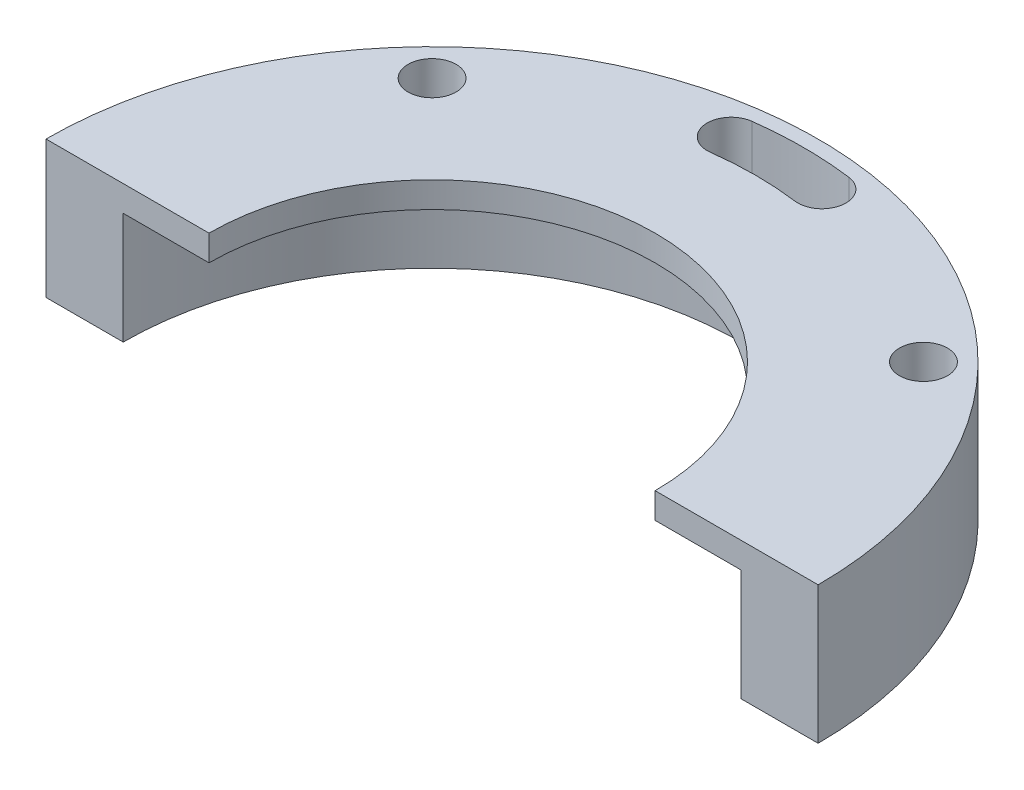
ISO-10303-21;
HEADER;
FILE_DESCRIPTION(('STEP AP214'),'2;1');
FILE_NAME('part.step','',(''),(''),'','','');
FILE_SCHEMA(('AUTOMOTIVE_DESIGN { 1 0 10303 214 1 1 1 1 }'));
ENDSEC;
DATA;
#1=APPLICATION_CONTEXT('core data for automotive mechanical design processes');
#2=APPLICATION_PROTOCOL_DEFINITION('international standard','automotive_design',2000,#1);
#3=PRODUCT_CONTEXT('',#1,'mechanical');
#4=PRODUCT('Part','Part','',(#3));
#5=PRODUCT_RELATED_PRODUCT_CATEGORY('part','',(#4));
#6=PRODUCT_DEFINITION_FORMATION('','',#4);
#7=PRODUCT_DEFINITION_CONTEXT('part definition',#1,'design');
#8=PRODUCT_DEFINITION('design','',#6,#7);
#9=PRODUCT_DEFINITION_SHAPE('','',#8);
#10=(LENGTH_UNIT() NAMED_UNIT(*) SI_UNIT(.MILLI.,.METRE.));
#11=(NAMED_UNIT(*) PLANE_ANGLE_UNIT() SI_UNIT($,.RADIAN.));
#12=(NAMED_UNIT(*) SI_UNIT($,.STERADIAN.) SOLID_ANGLE_UNIT());
#13=UNCERTAINTY_MEASURE_WITH_UNIT(LENGTH_MEASURE(1.E-05),#10,'distance_accuracy_value','');
#14=(GEOMETRIC_REPRESENTATION_CONTEXT(3) GLOBAL_UNCERTAINTY_ASSIGNED_CONTEXT((#13)) GLOBAL_UNIT_ASSIGNED_CONTEXT((#10,
#11,#12)) REPRESENTATION_CONTEXT('',''));
#15=CARTESIAN_POINT('',(0.,0.,0.));
#16=DIRECTION('',(0.,0.,1.));
#17=DIRECTION('',(1.,0.,0.));
#18=AXIS2_PLACEMENT_3D('',#15,#16,#17);
#19=CARTESIAN_POINT('',(0.,10.16,0.));
#20=DIRECTION('',(0.,-1.,0.));
#21=DIRECTION('',(0.,0.,-1.));
#22=AXIS2_PLACEMENT_3D('',#19,#20,#21);
#23=CYLINDRICAL_SURFACE('',#22,16.51);
#24=CARTESIAN_POINT('',(0.,8.255,0.));
#25=DIRECTION('',(0.,-1.,0.));
#26=DIRECTION('',(0.,0.,-1.));
#27=AXIS2_PLACEMENT_3D('',#24,#25,#26);
#28=CIRCLE('',#27,16.51);
#29=CARTESIAN_POINT('',(16.51,8.255,0.));
#30=VERTEX_POINT('',#29);
#31=CARTESIAN_POINT('',(-16.51,8.255,0.));
#32=VERTEX_POINT('',#31);
#33=EDGE_CURVE('E185',#30,#32,#28,.F.);
#34=ORIENTED_EDGE('',*,*,#33,.F.);
#35=DIRECTION('',(0.,-1.,0.));
#36=VECTOR('',#35,1.);
#37=CARTESIAN_POINT('',(16.51,10.16,0.));
#38=LINE('',#37,#36);
#39=CARTESIAN_POINT('',(16.51,10.16,0.));
#40=VERTEX_POINT('',#39);
#41=EDGE_CURVE('E172',#30,#40,#38,.F.);
#42=ORIENTED_EDGE('',*,*,#41,.T.);
#43=CARTESIAN_POINT('',(0.,10.16,0.));
#44=DIRECTION('',(0.,-1.,0.));
#45=DIRECTION('',(0.,0.,-1.));
#46=AXIS2_PLACEMENT_3D('',#43,#44,#45);
#47=CIRCLE('',#46,16.51);
#48=CARTESIAN_POINT('',(-16.51,10.16,0.));
#49=VERTEX_POINT('',#48);
#50=EDGE_CURVE('E188',#49,#40,#47,.T.);
#51=ORIENTED_EDGE('',*,*,#50,.F.);
#52=DIRECTION('',(0.,-1.,0.));
#53=VECTOR('',#52,1.);
#54=CARTESIAN_POINT('',(-16.51,10.16,0.));
#55=LINE('',#54,#53);
#56=EDGE_CURVE('E168',#49,#32,#55,.T.);
#57=ORIENTED_EDGE('',*,*,#56,.T.);
#58=EDGE_LOOP('',(#34,#42,#51,#57));
#59=FACE_BOUND('',#58,.T.);
#60=ADVANCED_FACE('F34',(#59),#23,.F.);
#61=CARTESIAN_POINT('',(0.,10.16,0.));
#62=DIRECTION('',(0.,-1.,0.));
#63=DIRECTION('',(0.,0.,-1.));
#64=AXIS2_PLACEMENT_3D('',#61,#62,#63);
#65=CYLINDRICAL_SURFACE('',#64,28.575);
#66=CARTESIAN_POINT('',(0.,10.16,0.));
#67=DIRECTION('',(0.,1.,0.));
#68=DIRECTION('',(0.,0.,1.));
#69=AXIS2_PLACEMENT_3D('',#66,#67,#68);
#70=CIRCLE('',#69,28.575);
#71=CARTESIAN_POINT('',(28.575,10.16,0.));
#72=VERTEX_POINT('',#71);
#73=CARTESIAN_POINT('',(-28.575,10.16,0.));
#74=VERTEX_POINT('',#73);
#75=EDGE_CURVE('E192',#72,#74,#70,.T.);
#76=ORIENTED_EDGE('',*,*,#75,.F.);
#77=DIRECTION('',(0.,-1.,0.));
#78=VECTOR('',#77,1.);
#79=CARTESIAN_POINT('',(28.575,10.16,0.));
#80=LINE('',#79,#78);
#81=CARTESIAN_POINT('',(28.575,0.,0.));
#82=VERTEX_POINT('',#81);
#83=EDGE_CURVE('E178',#72,#82,#80,.T.);
#84=ORIENTED_EDGE('',*,*,#83,.T.);
#85=CARTESIAN_POINT('',(0.,0.,0.));
#86=DIRECTION('',(0.,1.,0.));
#87=DIRECTION('',(0.,0.,1.));
#88=AXIS2_PLACEMENT_3D('',#85,#86,#87);
#89=CIRCLE('',#88,28.575);
#90=CARTESIAN_POINT('',(-28.575,0.,0.));
#91=VERTEX_POINT('',#90);
#92=EDGE_CURVE('E191',#82,#91,#89,.T.);
#93=ORIENTED_EDGE('',*,*,#92,.T.);
#94=DIRECTION('',(0.,-1.,0.));
#95=VECTOR('',#94,1.);
#96=CARTESIAN_POINT('',(-28.575,10.16,0.));
#97=LINE('',#96,#95);
#98=EDGE_CURVE('E175',#91,#74,#97,.F.);
#99=ORIENTED_EDGE('',*,*,#98,.T.);
#100=EDGE_LOOP('',(#76,#84,#93,#99));
#101=FACE_BOUND('',#100,.T.);
#102=ADVANCED_FACE('F36',(#101),#65,.T.);
#103=CARTESIAN_POINT('',(0.,10.16,0.));
#104=DIRECTION('',(0.,1.,0.));
#105=DIRECTION('',(0.,0.,1.));
#106=AXIS2_PLACEMENT_3D('',#103,#104,#105);
#107=PLANE('',#106);
#108=CARTESIAN_POINT('',(-3.35680734841919,10.16,-25.497483222381));
#109=DIRECTION('',(0.,1.,0.));
#110=DIRECTION('',(0.,0.,1.));
#111=AXIS2_PLACEMENT_3D('',#108,#109,#110);
#112=CIRCLE('',#111,1.77800000000001);
#113=CARTESIAN_POINT('',(-3.58888291818643,10.16,-27.2602721859036));
#114=VERTEX_POINT('',#113);
#115=CARTESIAN_POINT('',(-3.12473177865193,10.16,-23.7346942588583));
#116=VERTEX_POINT('',#115);
#117=EDGE_CURVE('E49',#114,#116,#112,.T.);
#118=ORIENTED_EDGE('',*,*,#117,.F.);
#119=CARTESIAN_POINT('',(0.,10.16,0.));
#120=DIRECTION('',(0.,1.,0.));
#121=DIRECTION('',(0.,0.,1.));
#122=AXIS2_PLACEMENT_3D('',#119,#120,#121);
#123=CIRCLE('',#122,27.4955);
#124=CARTESIAN_POINT('',(3.58888291818644,10.16,-27.2602721859036));
#125=VERTEX_POINT('',#124);
#126=EDGE_CURVE('E129',#125,#114,#123,.T.);
#127=ORIENTED_EDGE('',*,*,#126,.F.);
#128=CARTESIAN_POINT('',(3.35680734841918,10.16,-25.497483222381));
#129=DIRECTION('',(0.,1.,0.));
#130=DIRECTION('',(0.,0.,1.));
#131=AXIS2_PLACEMENT_3D('',#128,#129,#130);
#132=CIRCLE('',#131,1.778);
#133=CARTESIAN_POINT('',(3.12473177865193,10.16,-23.7346942588583));
#134=VERTEX_POINT('',#133);
#135=EDGE_CURVE('E132',#134,#125,#132,.T.);
#136=ORIENTED_EDGE('',*,*,#135,.F.);
#137=CARTESIAN_POINT('',(0.,10.16,0.));
#138=DIRECTION('',(0.,-1.,0.));
#139=DIRECTION('',(0.,0.,1.));
#140=AXIS2_PLACEMENT_3D('',#137,#138,#139);
#141=CIRCLE('',#140,23.9395);
#142=EDGE_CURVE('E138',#116,#134,#141,.T.);
#143=ORIENTED_EDGE('',*,*,#142,.F.);
#144=EDGE_LOOP('',(#118,#127,#136,#143));
#145=FACE_BOUND('',#144,.T.);
#146=CARTESIAN_POINT('',(-18.1850186451651,10.16,-18.185018645165));
#147=DIRECTION('',(0.,1.,0.));
#148=DIRECTION('',(0.,0.,1.));
#149=AXIS2_PLACEMENT_3D('',#146,#147,#148);
#150=CIRCLE('',#149,1.778);
#151=CARTESIAN_POINT('',(-18.1850186451651,10.16,-19.963018645165));
#152=VERTEX_POINT('',#151);
#153=EDGE_CURVE('E144',#152,#152,#150,.F.);
#154=ORIENTED_EDGE('',*,*,#153,.T.);
#155=EDGE_LOOP('',(#154));
#156=FACE_BOUND('',#155,.T.);
#157=CARTESIAN_POINT('',(18.1850186451651,10.16,-18.185018645165));
#158=DIRECTION('',(0.,1.,0.));
#159=DIRECTION('',(0.,0.,1.));
#160=AXIS2_PLACEMENT_3D('',#157,#158,#159);
#161=CIRCLE('',#160,1.778);
#162=CARTESIAN_POINT('',(18.1850186451651,10.16,-19.963018645165));
#163=VERTEX_POINT('',#162);
#164=EDGE_CURVE('E151',#163,#163,#161,.F.);
#165=ORIENTED_EDGE('',*,*,#164,.T.);
#166=EDGE_LOOP('',(#165));
#167=FACE_BOUND('',#166,.T.);
#168=DIRECTION('',(-1.,0.,0.));
#169=VECTOR('',#168,1.);
#170=CARTESIAN_POINT('',(-39.5745102781007,10.16,0.));
#171=LINE('',#170,#169);
#172=EDGE_CURVE('E164',#72,#40,#171,.T.);
#173=ORIENTED_EDGE('',*,*,#172,.F.);
#174=ORIENTED_EDGE('',*,*,#75,.T.);
#175=EDGE_CURVE('E157',#49,#74,#171,.T.);
#176=ORIENTED_EDGE('',*,*,#175,.F.);
#177=ORIENTED_EDGE('',*,*,#50,.T.);
#178=EDGE_LOOP('',(#173,#174,#176,#177));
#179=FACE_BOUND('',#178,.T.);
#180=ADVANCED_FACE('F215',(#145,#156,#167,#179),#107,.T.);
#181=CARTESIAN_POINT('',(0.,0.,0.));
#182=DIRECTION('',(0.,1.,0.));
#183=DIRECTION('',(0.,0.,1.));
#184=AXIS2_PLACEMENT_3D('',#181,#182,#183);
#185=PLANE('',#184);
#186=CARTESIAN_POINT('',(0.,0.,0.));
#187=DIRECTION('',(0.,1.,0.));
#188=DIRECTION('',(0.,0.,1.));
#189=AXIS2_PLACEMENT_3D('',#186,#187,#188);
#190=CIRCLE('',#189,27.4955);
#191=CARTESIAN_POINT('',(3.58888291818644,0.,-27.2602721859036));
#192=VERTEX_POINT('',#191);
#193=CARTESIAN_POINT('',(-3.58888291818643,0.,-27.2602721859036));
#194=VERTEX_POINT('',#193);
#195=EDGE_CURVE('E119',#192,#194,#190,.T.);
#196=ORIENTED_EDGE('',*,*,#195,.T.);
#197=CARTESIAN_POINT('',(-3.35680734841919,0.,-25.497483222381));
#198=DIRECTION('',(0.,1.,0.));
#199=DIRECTION('',(0.,0.,1.));
#200=AXIS2_PLACEMENT_3D('',#197,#198,#199);
#201=CIRCLE('',#200,1.77800000000001);
#202=CARTESIAN_POINT('',(-3.12473177865193,0.,-23.7346942588583));
#203=VERTEX_POINT('',#202);
#204=EDGE_CURVE('E113',#194,#203,#201,.T.);
#205=ORIENTED_EDGE('',*,*,#204,.T.);
#206=CARTESIAN_POINT('',(0.,0.,0.));
#207=DIRECTION('',(0.,-1.,0.));
#208=DIRECTION('',(0.,0.,1.));
#209=AXIS2_PLACEMENT_3D('',#206,#207,#208);
#210=CIRCLE('',#209,23.9395);
#211=CARTESIAN_POINT('',(3.12473177865193,0.,-23.7346942588583));
#212=VERTEX_POINT('',#211);
#213=EDGE_CURVE('E122',#203,#212,#210,.T.);
#214=ORIENTED_EDGE('',*,*,#213,.T.);
#215=CARTESIAN_POINT('',(3.35680734841918,0.,-25.497483222381));
#216=DIRECTION('',(0.,1.,0.));
#217=DIRECTION('',(0.,0.,1.));
#218=AXIS2_PLACEMENT_3D('',#215,#216,#217);
#219=CIRCLE('',#218,1.778);
#220=EDGE_CURVE('E57',#212,#192,#219,.T.);
#221=ORIENTED_EDGE('',*,*,#220,.T.);
#222=EDGE_LOOP('',(#196,#205,#214,#221));
#223=FACE_BOUND('',#222,.T.);
#224=CARTESIAN_POINT('',(-18.1850186451651,0.,-18.185018645165));
#225=DIRECTION('',(0.,-1.,0.));
#226=DIRECTION('',(0.,0.,-1.));
#227=AXIS2_PLACEMENT_3D('',#224,#225,#226);
#228=CIRCLE('',#227,1.778);
#229=CARTESIAN_POINT('',(-18.1850186451651,0.,-19.963018645165));
#230=VERTEX_POINT('',#229);
#231=EDGE_CURVE('E148',#230,#230,#228,.T.);
#232=ORIENTED_EDGE('',*,*,#231,.F.);
#233=EDGE_LOOP('',(#232));
#234=FACE_BOUND('',#233,.T.);
#235=CARTESIAN_POINT('',(18.1850186451651,0.,-18.185018645165));
#236=DIRECTION('',(0.,-1.,0.));
#237=DIRECTION('',(0.,0.,-1.));
#238=AXIS2_PLACEMENT_3D('',#235,#236,#237);
#239=CIRCLE('',#238,1.778);
#240=CARTESIAN_POINT('',(18.1850186451651,0.,-19.963018645165));
#241=VERTEX_POINT('',#240);
#242=EDGE_CURVE('E154',#241,#241,#239,.T.);
#243=ORIENTED_EDGE('',*,*,#242,.F.);
#244=EDGE_LOOP('',(#243));
#245=FACE_BOUND('',#244,.T.);
#246=ORIENTED_EDGE('',*,*,#92,.F.);
#247=DIRECTION('',(-1.,0.,0.));
#248=VECTOR('',#247,1.);
#249=CARTESIAN_POINT('',(-39.5745102781007,0.,0.));
#250=LINE('',#249,#248);
#251=CARTESIAN_POINT('',(22.86,0.,0.));
#252=VERTEX_POINT('',#251);
#253=EDGE_CURVE('E163',#82,#252,#250,.T.);
#254=ORIENTED_EDGE('',*,*,#253,.T.);
#255=CARTESIAN_POINT('',(0.,0.,0.));
#256=DIRECTION('',(0.,-1.,0.));
#257=DIRECTION('',(0.,0.,-1.));
#258=AXIS2_PLACEMENT_3D('',#255,#256,#257);
#259=CIRCLE('',#258,22.86);
#260=CARTESIAN_POINT('',(-22.86,0.,0.));
#261=VERTEX_POINT('',#260);
#262=EDGE_CURVE('E181',#261,#252,#259,.T.);
#263=ORIENTED_EDGE('',*,*,#262,.F.);
#264=EDGE_CURVE('E160',#261,#91,#250,.T.);
#265=ORIENTED_EDGE('',*,*,#264,.T.);
#266=EDGE_LOOP('',(#246,#254,#263,#265));
#267=FACE_BOUND('',#266,.T.);
#268=ADVANCED_FACE('F126',(#223,#234,#245,#267),#185,.F.);
#269=CARTESIAN_POINT('',(0.,8.255,0.));
#270=DIRECTION('',(0.,-1.,0.));
#271=DIRECTION('',(0.,0.,-1.));
#272=AXIS2_PLACEMENT_3D('',#269,#270,#271);
#273=PLANE('',#272);
#274=DIRECTION('',(1.,0.,0.));
#275=VECTOR('',#274,1.);
#276=CARTESIAN_POINT('',(0.,8.255,0.));
#277=LINE('',#276,#275);
#278=CARTESIAN_POINT('',(-22.86,8.255,0.));
#279=VERTEX_POINT('',#278);
#280=EDGE_CURVE('E166',#279,#32,#277,.T.);
#281=ORIENTED_EDGE('',*,*,#280,.F.);
#282=CARTESIAN_POINT('',(0.,8.255,0.));
#283=DIRECTION('',(0.,-1.,0.));
#284=DIRECTION('',(0.,0.,-1.));
#285=AXIS2_PLACEMENT_3D('',#282,#283,#284);
#286=CIRCLE('',#285,22.86);
#287=CARTESIAN_POINT('',(22.86,8.255,0.));
#288=VERTEX_POINT('',#287);
#289=EDGE_CURVE('E182',#279,#288,#286,.T.);
#290=ORIENTED_EDGE('',*,*,#289,.T.);
#291=EDGE_CURVE('E169',#30,#288,#277,.T.);
#292=ORIENTED_EDGE('',*,*,#291,.F.);
#293=ORIENTED_EDGE('',*,*,#33,.T.);
#294=EDGE_LOOP('',(#281,#290,#292,#293));
#295=FACE_BOUND('',#294,.T.);
#296=ADVANCED_FACE('F221',(#295),#273,.T.);
#297=CARTESIAN_POINT('',(0.,8.255,0.));
#298=DIRECTION('',(0.,-1.,0.));
#299=DIRECTION('',(0.,0.,-1.));
#300=AXIS2_PLACEMENT_3D('',#297,#298,#299);
#301=CYLINDRICAL_SURFACE('',#300,22.86);
#302=ORIENTED_EDGE('',*,*,#262,.T.);
#303=DIRECTION('',(0.,-1.,0.));
#304=VECTOR('',#303,1.);
#305=CARTESIAN_POINT('',(22.86,8.255,0.));
#306=LINE('',#305,#304);
#307=EDGE_CURVE('E11',#252,#288,#306,.F.);
#308=ORIENTED_EDGE('',*,*,#307,.T.);
#309=ORIENTED_EDGE('',*,*,#289,.F.);
#310=DIRECTION('',(0.,-1.,0.));
#311=VECTOR('',#310,1.);
#312=CARTESIAN_POINT('',(-22.86,8.255,0.));
#313=LINE('',#312,#311);
#314=EDGE_CURVE('E42',#279,#261,#313,.T.);
#315=ORIENTED_EDGE('',*,*,#314,.T.);
#316=EDGE_LOOP('',(#302,#308,#309,#315));
#317=FACE_BOUND('',#316,.T.);
#318=ADVANCED_FACE('F202',(#317),#301,.F.);
#319=CARTESIAN_POINT('',(-39.5745102781007,0.,0.));
#320=DIRECTION('',(0.,0.,-1.));
#321=DIRECTION('',(-1.,0.,0.));
#322=AXIS2_PLACEMENT_3D('',#319,#320,#321);
#323=PLANE('',#322);
#324=ORIENTED_EDGE('',*,*,#264,.F.);
#325=ORIENTED_EDGE('',*,*,#314,.F.);
#326=ORIENTED_EDGE('',*,*,#280,.T.);
#327=ORIENTED_EDGE('',*,*,#56,.F.);
#328=ORIENTED_EDGE('',*,*,#175,.T.);
#329=ORIENTED_EDGE('',*,*,#98,.F.);
#330=EDGE_LOOP('',(#324,#325,#326,#327,#328,#329));
#331=FACE_BOUND('',#330,.T.);
#332=ADVANCED_FACE('F222',(#331),#323,.F.);
#333=ORIENTED_EDGE('',*,*,#172,.T.);
#334=ORIENTED_EDGE('',*,*,#41,.F.);
#335=ORIENTED_EDGE('',*,*,#291,.T.);
#336=ORIENTED_EDGE('',*,*,#307,.F.);
#337=ORIENTED_EDGE('',*,*,#253,.F.);
#338=ORIENTED_EDGE('',*,*,#83,.F.);
#339=EDGE_LOOP('',(#333,#334,#335,#336,#337,#338));
#340=FACE_BOUND('',#339,.T.);
#341=ADVANCED_FACE('F209',(#340),#323,.F.);
#342=CARTESIAN_POINT('',(18.1850186451651,10.161,-18.185018645165));
#343=DIRECTION('',(0.,-1.,0.));
#344=DIRECTION('',(0.,0.,-1.));
#345=AXIS2_PLACEMENT_3D('',#342,#343,#344);
#346=CYLINDRICAL_SURFACE('',#345,1.778);
#347=CARTESIAN_POINT('',(18.1850186451651,10.16,-19.963018645165));
#348=CARTESIAN_POINT('',(18.1850186451651,10.0541666666667,-19.963018645165));
#349=CARTESIAN_POINT('',(18.1850186451651,9.94833333333333,-19.963018645165));
#350=CARTESIAN_POINT('',(18.1850186451651,9.73666666666667,-19.963018645165));
#351=CARTESIAN_POINT('',(18.1850186451651,9.63083333333333,-19.963018645165));
#352=CARTESIAN_POINT('',(18.1850186451651,9.41916666666667,-19.963018645165));
#353=CARTESIAN_POINT('',(18.1850186451651,9.31333333333333,-19.963018645165));
#354=CARTESIAN_POINT('',(18.1850186451651,9.10166666666667,-19.963018645165));
#355=CARTESIAN_POINT('',(18.1850186451651,8.99583333333333,-19.963018645165));
#356=CARTESIAN_POINT('',(18.1850186451651,8.78416666666667,-19.963018645165));
#357=CARTESIAN_POINT('',(18.1850186451651,8.67833333333333,-19.963018645165));
#358=CARTESIAN_POINT('',(18.1850186451651,8.46666666666667,-19.963018645165));
#359=CARTESIAN_POINT('',(18.1850186451651,8.36083333333333,-19.963018645165));
#360=CARTESIAN_POINT('',(18.1850186451651,8.14916666666667,-19.963018645165));
#361=CARTESIAN_POINT('',(18.1850186451651,8.04333333333333,-19.963018645165));
#362=CARTESIAN_POINT('',(18.1850186451651,7.83166666666667,-19.963018645165));
#363=CARTESIAN_POINT('',(18.1850186451651,7.72583333333333,-19.963018645165));
#364=CARTESIAN_POINT('',(18.1850186451651,7.51416666666667,-19.963018645165));
#365=CARTESIAN_POINT('',(18.1850186451651,7.40833333333333,-19.963018645165));
#366=CARTESIAN_POINT('',(18.1850186451651,7.19666666666667,-19.963018645165));
#367=CARTESIAN_POINT('',(18.1850186451651,7.09083333333333,-19.963018645165));
#368=CARTESIAN_POINT('',(18.1850186451651,6.87916666666667,-19.963018645165));
#369=CARTESIAN_POINT('',(18.1850186451651,6.77333333333333,-19.963018645165));
#370=CARTESIAN_POINT('',(18.1850186451651,6.56166666666667,-19.963018645165));
#371=CARTESIAN_POINT('',(18.1850186451651,6.45583333333333,-19.963018645165));
#372=CARTESIAN_POINT('',(18.1850186451651,6.24416666666667,-19.963018645165));
#373=CARTESIAN_POINT('',(18.1850186451651,6.13833333333333,-19.963018645165));
#374=CARTESIAN_POINT('',(18.1850186451651,5.92666666666667,-19.963018645165));
#375=CARTESIAN_POINT('',(18.1850186451651,5.82083333333333,-19.963018645165));
#376=CARTESIAN_POINT('',(18.1850186451651,5.60916666666667,-19.963018645165));
#377=CARTESIAN_POINT('',(18.1850186451651,5.50333333333333,-19.963018645165));
#378=CARTESIAN_POINT('',(18.1850186451651,5.29166666666667,-19.963018645165));
#379=CARTESIAN_POINT('',(18.1850186451651,5.18583333333333,-19.963018645165));
#380=CARTESIAN_POINT('',(18.1850186451651,4.97416666666667,-19.963018645165));
#381=CARTESIAN_POINT('',(18.1850186451651,4.86833333333333,-19.963018645165));
#382=CARTESIAN_POINT('',(18.1850186451651,4.65666666666667,-19.963018645165));
#383=CARTESIAN_POINT('',(18.1850186451651,4.55083333333334,-19.963018645165));
#384=CARTESIAN_POINT('',(18.1850186451651,4.33916666666667,-19.963018645165));
#385=CARTESIAN_POINT('',(18.1850186451651,4.23333333333333,-19.963018645165));
#386=CARTESIAN_POINT('',(18.1850186451651,4.02166666666667,-19.963018645165));
#387=CARTESIAN_POINT('',(18.1850186451651,3.91583333333333,-19.963018645165));
#388=CARTESIAN_POINT('',(18.1850186451651,3.70416666666667,-19.963018645165));
#389=CARTESIAN_POINT('',(18.1850186451651,3.59833333333333,-19.963018645165));
#390=CARTESIAN_POINT('',(18.1850186451651,3.38666666666667,-19.963018645165));
#391=CARTESIAN_POINT('',(18.1850186451651,3.28083333333333,-19.963018645165));
#392=CARTESIAN_POINT('',(18.1850186451651,3.06916666666667,-19.963018645165));
#393=CARTESIAN_POINT('',(18.1850186451651,2.96333333333333,-19.963018645165));
#394=CARTESIAN_POINT('',(18.1850186451651,2.75166666666667,-19.963018645165));
#395=CARTESIAN_POINT('',(18.1850186451651,2.64583333333333,-19.963018645165));
#396=CARTESIAN_POINT('',(18.1850186451651,2.43416666666667,-19.963018645165));
#397=CARTESIAN_POINT('',(18.1850186451651,2.32833333333334,-19.963018645165));
#398=CARTESIAN_POINT('',(18.1850186451651,2.11666666666667,-19.963018645165));
#399=CARTESIAN_POINT('',(18.1850186451651,2.01083333333334,-19.963018645165));
#400=CARTESIAN_POINT('',(18.1850186451651,1.79916666666667,-19.963018645165));
#401=CARTESIAN_POINT('',(18.1850186451651,1.69333333333334,-19.963018645165));
#402=CARTESIAN_POINT('',(18.1850186451651,1.48166666666667,-19.963018645165));
#403=CARTESIAN_POINT('',(18.1850186451651,1.37583333333334,-19.963018645165));
#404=CARTESIAN_POINT('',(18.1850186451651,1.16416666666667,-19.963018645165));
#405=CARTESIAN_POINT('',(18.1850186451651,1.05833333333334,-19.963018645165));
#406=CARTESIAN_POINT('',(18.1850186451651,0.84666666666667,-19.963018645165));
#407=CARTESIAN_POINT('',(18.1850186451651,0.740833333333336,-19.963018645165));
#408=CARTESIAN_POINT('',(18.1850186451651,0.529166666666669,-19.963018645165));
#409=CARTESIAN_POINT('',(18.1850186451651,0.423333333333336,-19.963018645165));
#410=CARTESIAN_POINT('',(18.1850186451651,0.21166666666667,-19.963018645165));
#411=CARTESIAN_POINT('',(18.1850186451651,0.105833333333336,-19.963018645165));
#412=CARTESIAN_POINT('',(18.1850186451651,0.,-19.963018645165));
#413=B_SPLINE_CURVE_WITH_KNOTS('',3,(#347,#348,#349,#350,#351,#352,#353,#354,#355,#356,#357,
#358,#359,#360,#361,#362,#363,#364,#365,#366,#367,#368,#369,#370,#371,#372,#373,#374,#375,#376,
#377,#378,#379,#380,#381,#382,#383,#384,#385,#386,#387,#388,#389,#390,#391,#392,#393,#394,#395,
#396,#397,#398,#399,#400,#401,#402,#403,#404,#405,#406,#407,#408,#409,#410,#411,#412),
.UNSPECIFIED.,.F.,.F.,(4,2,2,2,2,2,2,2,2,2,2,2,2,2,2,2,2,2,2,2,2,2,2,2,2,2,2,2,2,2,2,2,4),(0.,
0.3175,0.635,0.9525,1.27,1.5875,1.905,2.2225,2.54,2.8575,3.175,3.4925,3.81,4.1275,4.445,4.7625,
5.08,5.3975,5.715,6.0325,6.35,6.6675,6.985,7.3025,7.62,7.9375,8.255,8.5725,8.89,9.2075,9.525,
9.8425,10.16),.UNSPECIFIED.);
#414=EDGE_CURVE('BSEAM229',#163,#241,#413,.T.);
#415=ORIENTED_EDGE('',*,*,#164,.F.);
#416=ORIENTED_EDGE('',*,*,#242,.T.);
#417=ORIENTED_EDGE('',*,*,#414,.T.);
#418=ORIENTED_EDGE('',*,*,#414,.F.);
#419=EDGE_LOOP('',(#415,#417,#416,#418));
#420=FACE_BOUND('',#419,.T.);
#421=ADVANCED_FACE('F229',(#420),#346,.F.);
#422=CARTESIAN_POINT('',(-18.1850186451651,10.161,-18.185018645165));
#423=DIRECTION('',(0.,-1.,0.));
#424=DIRECTION('',(0.,0.,-1.));
#425=AXIS2_PLACEMENT_3D('',#422,#423,#424);
#426=CYLINDRICAL_SURFACE('',#425,1.778);
#427=CARTESIAN_POINT('',(-18.1850186451651,10.16,-19.963018645165));
#428=CARTESIAN_POINT('',(-18.1850186451651,10.0541666666667,-19.963018645165));
#429=CARTESIAN_POINT('',(-18.1850186451651,9.94833333333333,-19.963018645165));
#430=CARTESIAN_POINT('',(-18.1850186451651,9.73666666666667,-19.963018645165));
#431=CARTESIAN_POINT('',(-18.1850186451651,9.63083333333333,-19.963018645165));
#432=CARTESIAN_POINT('',(-18.1850186451651,9.41916666666667,-19.963018645165));
#433=CARTESIAN_POINT('',(-18.1850186451651,9.31333333333333,-19.963018645165));
#434=CARTESIAN_POINT('',(-18.1850186451651,9.10166666666667,-19.963018645165));
#435=CARTESIAN_POINT('',(-18.1850186451651,8.99583333333333,-19.963018645165));
#436=CARTESIAN_POINT('',(-18.1850186451651,8.78416666666667,-19.963018645165));
#437=CARTESIAN_POINT('',(-18.1850186451651,8.67833333333333,-19.963018645165));
#438=CARTESIAN_POINT('',(-18.1850186451651,8.46666666666667,-19.963018645165));
#439=CARTESIAN_POINT('',(-18.1850186451651,8.36083333333333,-19.963018645165));
#440=CARTESIAN_POINT('',(-18.1850186451651,8.14916666666667,-19.963018645165));
#441=CARTESIAN_POINT('',(-18.1850186451651,8.04333333333333,-19.963018645165));
#442=CARTESIAN_POINT('',(-18.1850186451651,7.83166666666667,-19.963018645165));
#443=CARTESIAN_POINT('',(-18.1850186451651,7.72583333333333,-19.963018645165));
#444=CARTESIAN_POINT('',(-18.1850186451651,7.51416666666667,-19.963018645165));
#445=CARTESIAN_POINT('',(-18.1850186451651,7.40833333333333,-19.963018645165));
#446=CARTESIAN_POINT('',(-18.1850186451651,7.19666666666667,-19.963018645165));
#447=CARTESIAN_POINT('',(-18.1850186451651,7.09083333333333,-19.963018645165));
#448=CARTESIAN_POINT('',(-18.1850186451651,6.87916666666667,-19.963018645165));
#449=CARTESIAN_POINT('',(-18.1850186451651,6.77333333333333,-19.963018645165));
#450=CARTESIAN_POINT('',(-18.1850186451651,6.56166666666667,-19.963018645165));
#451=CARTESIAN_POINT('',(-18.1850186451651,6.45583333333333,-19.963018645165));
#452=CARTESIAN_POINT('',(-18.1850186451651,6.24416666666667,-19.963018645165));
#453=CARTESIAN_POINT('',(-18.1850186451651,6.13833333333333,-19.963018645165));
#454=CARTESIAN_POINT('',(-18.1850186451651,5.92666666666667,-19.963018645165));
#455=CARTESIAN_POINT('',(-18.1850186451651,5.82083333333333,-19.963018645165));
#456=CARTESIAN_POINT('',(-18.1850186451651,5.60916666666667,-19.963018645165));
#457=CARTESIAN_POINT('',(-18.1850186451651,5.50333333333333,-19.963018645165));
#458=CARTESIAN_POINT('',(-18.1850186451651,5.29166666666667,-19.963018645165));
#459=CARTESIAN_POINT('',(-18.1850186451651,5.18583333333333,-19.963018645165));
#460=CARTESIAN_POINT('',(-18.1850186451651,4.97416666666667,-19.963018645165));
#461=CARTESIAN_POINT('',(-18.1850186451651,4.86833333333333,-19.963018645165));
#462=CARTESIAN_POINT('',(-18.1850186451651,4.65666666666667,-19.963018645165));
#463=CARTESIAN_POINT('',(-18.1850186451651,4.55083333333334,-19.963018645165));
#464=CARTESIAN_POINT('',(-18.1850186451651,4.33916666666667,-19.963018645165));
#465=CARTESIAN_POINT('',(-18.1850186451651,4.23333333333333,-19.963018645165));
#466=CARTESIAN_POINT('',(-18.1850186451651,4.02166666666667,-19.963018645165));
#467=CARTESIAN_POINT('',(-18.1850186451651,3.91583333333333,-19.963018645165));
#468=CARTESIAN_POINT('',(-18.1850186451651,3.70416666666667,-19.963018645165));
#469=CARTESIAN_POINT('',(-18.1850186451651,3.59833333333333,-19.963018645165));
#470=CARTESIAN_POINT('',(-18.1850186451651,3.38666666666667,-19.963018645165));
#471=CARTESIAN_POINT('',(-18.1850186451651,3.28083333333333,-19.963018645165));
#472=CARTESIAN_POINT('',(-18.1850186451651,3.06916666666667,-19.963018645165));
#473=CARTESIAN_POINT('',(-18.1850186451651,2.96333333333333,-19.963018645165));
#474=CARTESIAN_POINT('',(-18.1850186451651,2.75166666666667,-19.963018645165));
#475=CARTESIAN_POINT('',(-18.1850186451651,2.64583333333333,-19.963018645165));
#476=CARTESIAN_POINT('',(-18.1850186451651,2.43416666666667,-19.963018645165));
#477=CARTESIAN_POINT('',(-18.1850186451651,2.32833333333334,-19.963018645165));
#478=CARTESIAN_POINT('',(-18.1850186451651,2.11666666666667,-19.963018645165));
#479=CARTESIAN_POINT('',(-18.1850186451651,2.01083333333334,-19.963018645165));
#480=CARTESIAN_POINT('',(-18.1850186451651,1.79916666666667,-19.963018645165));
#481=CARTESIAN_POINT('',(-18.1850186451651,1.69333333333334,-19.963018645165));
#482=CARTESIAN_POINT('',(-18.1850186451651,1.48166666666667,-19.963018645165));
#483=CARTESIAN_POINT('',(-18.1850186451651,1.37583333333334,-19.963018645165));
#484=CARTESIAN_POINT('',(-18.1850186451651,1.16416666666667,-19.963018645165));
#485=CARTESIAN_POINT('',(-18.1850186451651,1.05833333333334,-19.963018645165));
#486=CARTESIAN_POINT('',(-18.1850186451651,0.84666666666667,-19.963018645165));
#487=CARTESIAN_POINT('',(-18.1850186451651,0.740833333333336,-19.963018645165));
#488=CARTESIAN_POINT('',(-18.1850186451651,0.529166666666669,-19.963018645165));
#489=CARTESIAN_POINT('',(-18.1850186451651,0.423333333333336,-19.963018645165));
#490=CARTESIAN_POINT('',(-18.1850186451651,0.21166666666667,-19.963018645165));
#491=CARTESIAN_POINT('',(-18.1850186451651,0.105833333333336,-19.963018645165));
#492=CARTESIAN_POINT('',(-18.1850186451651,0.,-19.963018645165));
#493=B_SPLINE_CURVE_WITH_KNOTS('',3,(#427,#428,#429,#430,#431,#432,#433,#434,#435,#436,#437,
#438,#439,#440,#441,#442,#443,#444,#445,#446,#447,#448,#449,#450,#451,#452,#453,#454,#455,#456,
#457,#458,#459,#460,#461,#462,#463,#464,#465,#466,#467,#468,#469,#470,#471,#472,#473,#474,#475,
#476,#477,#478,#479,#480,#481,#482,#483,#484,#485,#486,#487,#488,#489,#490,#491,#492),
.UNSPECIFIED.,.F.,.F.,(4,2,2,2,2,2,2,2,2,2,2,2,2,2,2,2,2,2,2,2,2,2,2,2,2,2,2,2,2,2,2,2,4),(0.,
0.3175,0.635,0.9525,1.27,1.5875,1.905,2.2225,2.54,2.8575,3.175,3.4925,3.81,4.1275,4.445,4.7625,
5.08,5.3975,5.715,6.0325,6.35,6.6675,6.985,7.3025,7.62,7.9375,8.255,8.5725,8.89,9.2075,9.525,
9.8425,10.16),.UNSPECIFIED.);
#494=EDGE_CURVE('BSEAM271',#152,#230,#493,.T.);
#495=ORIENTED_EDGE('',*,*,#153,.F.);
#496=ORIENTED_EDGE('',*,*,#231,.T.);
#497=ORIENTED_EDGE('',*,*,#494,.T.);
#498=ORIENTED_EDGE('',*,*,#494,.F.);
#499=EDGE_LOOP('',(#495,#497,#496,#498));
#500=FACE_BOUND('',#499,.T.);
#501=ADVANCED_FACE('F271',(#500),#426,.F.);
#502=CARTESIAN_POINT('',(-3.35680734841919,0.,-25.497483222381));
#503=DIRECTION('',(0.,1.,0.));
#504=DIRECTION('',(0.,0.,1.));
#505=AXIS2_PLACEMENT_3D('',#502,#503,#504);
#506=CYLINDRICAL_SURFACE('',#505,1.77800000000001);
#507=ORIENTED_EDGE('',*,*,#117,.T.);
#508=DIRECTION('',(0.,1.,0.));
#509=VECTOR('',#508,1.);
#510=CARTESIAN_POINT('',(-3.12473177865193,0.,-23.7346942588583));
#511=LINE('',#510,#509);
#512=EDGE_CURVE('E109',#203,#116,#511,.T.);
#513=ORIENTED_EDGE('',*,*,#512,.F.);
#514=ORIENTED_EDGE('',*,*,#204,.F.);
#515=DIRECTION('',(0.,1.,0.));
#516=VECTOR('',#515,1.);
#517=CARTESIAN_POINT('',(-3.58888291818643,0.,-27.2602721859036));
#518=LINE('',#517,#516);
#519=EDGE_CURVE('E142',#194,#114,#518,.T.);
#520=ORIENTED_EDGE('',*,*,#519,.T.);
#521=EDGE_LOOP('',(#507,#513,#514,#520));
#522=FACE_BOUND('',#521,.T.);
#523=ADVANCED_FACE('F111',(#522),#506,.F.);
#524=CARTESIAN_POINT('',(0.,0.,0.));
#525=DIRECTION('',(0.,1.,0.));
#526=DIRECTION('',(0.,0.,1.));
#527=AXIS2_PLACEMENT_3D('',#524,#525,#526);
#528=CYLINDRICAL_SURFACE('',#527,27.4955);
#529=ORIENTED_EDGE('',*,*,#126,.T.);
#530=ORIENTED_EDGE('',*,*,#519,.F.);
#531=ORIENTED_EDGE('',*,*,#195,.F.);
#532=DIRECTION('',(0.,1.,0.));
#533=VECTOR('',#532,1.);
#534=CARTESIAN_POINT('',(3.58888291818644,0.,-27.2602721859036));
#535=LINE('',#534,#533);
#536=EDGE_CURVE('E145',#192,#125,#535,.T.);
#537=ORIENTED_EDGE('',*,*,#536,.T.);
#538=EDGE_LOOP('',(#529,#530,#531,#537));
#539=FACE_BOUND('',#538,.T.);
#540=ADVANCED_FACE('F301',(#539),#528,.F.);
#541=CARTESIAN_POINT('',(3.35680734841918,0.,-25.497483222381));
#542=DIRECTION('',(0.,1.,0.));
#543=DIRECTION('',(0.,0.,1.));
#544=AXIS2_PLACEMENT_3D('',#541,#542,#543);
#545=CYLINDRICAL_SURFACE('',#544,1.778);
#546=ORIENTED_EDGE('',*,*,#135,.T.);
#547=ORIENTED_EDGE('',*,*,#536,.F.);
#548=ORIENTED_EDGE('',*,*,#220,.F.);
#549=DIRECTION('',(0.,1.,0.));
#550=VECTOR('',#549,1.);
#551=CARTESIAN_POINT('',(3.12473177865193,0.,-23.7346942588583));
#552=LINE('',#551,#550);
#553=EDGE_CURVE('E118',#212,#134,#552,.T.);
#554=ORIENTED_EDGE('',*,*,#553,.T.);
#555=EDGE_LOOP('',(#546,#547,#548,#554));
#556=FACE_BOUND('',#555,.T.);
#557=ADVANCED_FACE('F310',(#556),#545,.F.);
#558=CARTESIAN_POINT('',(0.,0.,0.));
#559=DIRECTION('',(0.,1.,0.));
#560=DIRECTION('',(0.,0.,1.));
#561=AXIS2_PLACEMENT_3D('',#558,#559,#560);
#562=CYLINDRICAL_SURFACE('',#561,23.9395);
#563=ORIENTED_EDGE('',*,*,#142,.T.);
#564=ORIENTED_EDGE('',*,*,#553,.F.);
#565=ORIENTED_EDGE('',*,*,#213,.F.);
#566=ORIENTED_EDGE('',*,*,#512,.T.);
#567=EDGE_LOOP('',(#563,#564,#565,#566));
#568=FACE_BOUND('',#567,.T.);
#569=ADVANCED_FACE('F123',(#568),#562,.T.);
#570=CLOSED_SHELL('',(#60,#102,#180,#268,#296,#318,#332,#341,#421,#501,#523,#540,#557,#569));
#571=MANIFOLD_SOLID_BREP('B2',#570);
#572=ADVANCED_BREP_SHAPE_REPRESENTATION('',(#18,#571),#14);
#573=SHAPE_DEFINITION_REPRESENTATION(#9,#572);
ENDSEC;
END-ISO-10303-21;
